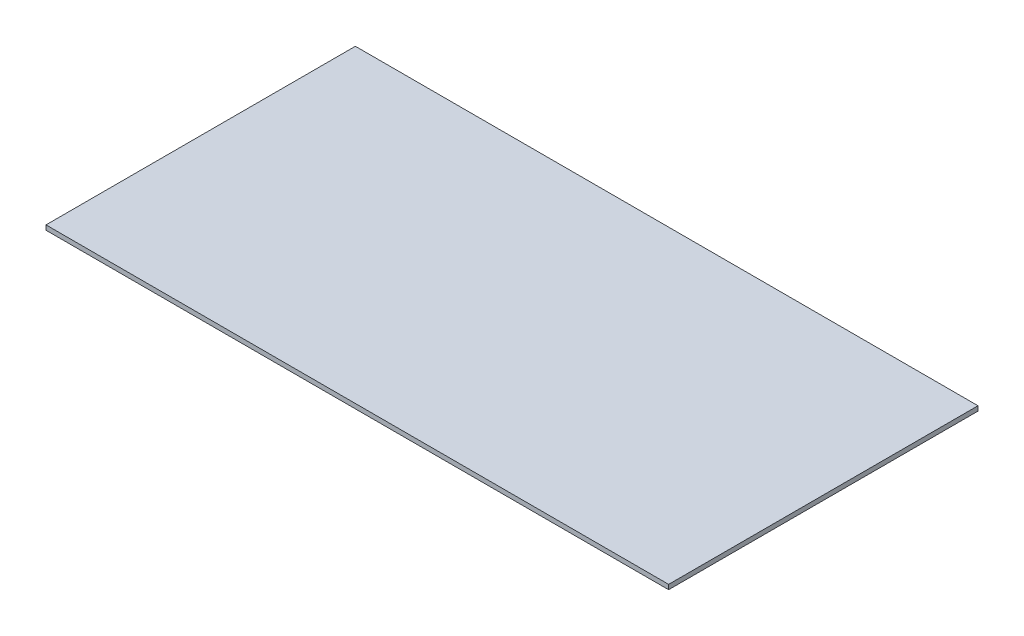
ISO-10303-21;
HEADER;
FILE_DESCRIPTION(('STEP AP214'),'2;1');
FILE_NAME('part.step','',(''),(''),'','','');
FILE_SCHEMA(('AUTOMOTIVE_DESIGN { 1 0 10303 214 1 1 1 1 }'));
ENDSEC;
DATA;
#1=APPLICATION_CONTEXT('core data for automotive mechanical design processes');
#2=APPLICATION_PROTOCOL_DEFINITION('international standard','automotive_design',2000,#1);
#3=PRODUCT_CONTEXT('',#1,'mechanical');
#4=PRODUCT('Part','Part','',(#3));
#5=PRODUCT_RELATED_PRODUCT_CATEGORY('part','',(#4));
#6=PRODUCT_DEFINITION_FORMATION('','',#4);
#7=PRODUCT_DEFINITION_CONTEXT('part definition',#1,'design');
#8=PRODUCT_DEFINITION('design','',#6,#7);
#9=PRODUCT_DEFINITION_SHAPE('','',#8);
#10=(LENGTH_UNIT() NAMED_UNIT(*) SI_UNIT(.MILLI.,.METRE.));
#11=(NAMED_UNIT(*) PLANE_ANGLE_UNIT() SI_UNIT($,.RADIAN.));
#12=(NAMED_UNIT(*) SI_UNIT($,.STERADIAN.) SOLID_ANGLE_UNIT());
#13=UNCERTAINTY_MEASURE_WITH_UNIT(LENGTH_MEASURE(1.E-05),#10,'distance_accuracy_value','');
#14=(GEOMETRIC_REPRESENTATION_CONTEXT(3) GLOBAL_UNCERTAINTY_ASSIGNED_CONTEXT((#13)) GLOBAL_UNIT_ASSIGNED_CONTEXT((#10,
#11,#12)) REPRESENTATION_CONTEXT('',''));
#15=CARTESIAN_POINT('',(0.,0.,0.));
#16=DIRECTION('',(0.,0.,1.));
#17=DIRECTION('',(1.,0.,0.));
#18=AXIS2_PLACEMENT_3D('',#15,#16,#17);
#19=CARTESIAN_POINT('',(-802.046035805626,12.,-363.286445012788));
#20=DIRECTION('',(1.,0.,0.));
#21=DIRECTION('',(0.,0.,-1.));
#22=AXIS2_PLACEMENT_3D('',#19,#20,#21);
#23=PLANE('',#22);
#24=DIRECTION('',(0.,0.,1.));
#25=VECTOR('',#24,1.);
#26=CARTESIAN_POINT('',(-802.046035805626,0.,-363.286445012788));
#27=LINE('',#26,#25);
#28=CARTESIAN_POINT('',(-802.046035805626,0.,-363.286445012788));
#29=VERTEX_POINT('',#28);
#30=CARTESIAN_POINT('',(-802.046035805626,0.,431.713554987212));
#31=VERTEX_POINT('',#30);
#32=EDGE_CURVE('E96',#29,#31,#27,.T.);
#33=ORIENTED_EDGE('',*,*,#32,.T.);
#34=DIRECTION('',(0.,-1.,0.));
#35=VECTOR('',#34,1.);
#36=CARTESIAN_POINT('',(-802.046035805626,12.,431.713554987212));
#37=LINE('',#36,#35);
#38=CARTESIAN_POINT('',(-802.046035805626,12.,431.713554987212));
#39=VERTEX_POINT('',#38);
#40=EDGE_CURVE('E11',#39,#31,#37,.T.);
#41=ORIENTED_EDGE('',*,*,#40,.F.);
#42=DIRECTION('',(0.,0.,1.));
#43=VECTOR('',#42,1.);
#44=CARTESIAN_POINT('',(-802.046035805626,12.,-363.286445012788));
#45=LINE('',#44,#43);
#46=CARTESIAN_POINT('',(-802.046035805626,12.,-363.286445012788));
#47=VERTEX_POINT('',#46);
#48=EDGE_CURVE('E84',#47,#39,#45,.T.);
#49=ORIENTED_EDGE('',*,*,#48,.F.);
#50=DIRECTION('',(0.,-1.,0.));
#51=VECTOR('',#50,1.);
#52=CARTESIAN_POINT('',(-802.046035805626,12.,-363.286445012788));
#53=LINE('',#52,#51);
#54=EDGE_CURVE('E92',#47,#29,#53,.T.);
#55=ORIENTED_EDGE('',*,*,#54,.T.);
#56=EDGE_LOOP('',(#33,#41,#49,#55));
#57=FACE_BOUND('',#56,.T.);
#58=ADVANCED_FACE('F33',(#57),#23,.F.);
#59=CARTESIAN_POINT('',(-802.046035805626,12.,431.713554987212));
#60=DIRECTION('',(0.,0.,-1.));
#61=DIRECTION('',(-1.,0.,0.));
#62=AXIS2_PLACEMENT_3D('',#59,#60,#61);
#63=PLANE('',#62);
#64=DIRECTION('',(1.,0.,0.));
#65=VECTOR('',#64,1.);
#66=CARTESIAN_POINT('',(-802.046035805626,0.,431.713554987212));
#67=LINE('',#66,#65);
#68=CARTESIAN_POINT('',(797.953964194374,0.,431.713554987212));
#69=VERTEX_POINT('',#68);
#70=EDGE_CURVE('E88',#31,#69,#67,.T.);
#71=ORIENTED_EDGE('',*,*,#70,.T.);
#72=DIRECTION('',(0.,-1.,0.));
#73=VECTOR('',#72,1.);
#74=CARTESIAN_POINT('',(797.953964194374,12.,431.713554987212));
#75=LINE('',#74,#73);
#76=CARTESIAN_POINT('',(797.953964194374,12.,431.713554987212));
#77=VERTEX_POINT('',#76);
#78=EDGE_CURVE('E41',#77,#69,#75,.T.);
#79=ORIENTED_EDGE('',*,*,#78,.F.);
#80=DIRECTION('',(1.,0.,0.));
#81=VECTOR('',#80,1.);
#82=CARTESIAN_POINT('',(-802.046035805626,12.,431.713554987212));
#83=LINE('',#82,#81);
#84=EDGE_CURVE('E79',#39,#77,#83,.T.);
#85=ORIENTED_EDGE('',*,*,#84,.F.);
#86=ORIENTED_EDGE('',*,*,#40,.T.);
#87=EDGE_LOOP('',(#71,#79,#85,#86));
#88=FACE_BOUND('',#87,.T.);
#89=ADVANCED_FACE('F87',(#88),#63,.F.);
#90=CARTESIAN_POINT('',(797.953964194374,12.,-363.286445012788));
#91=DIRECTION('',(-1.,0.,0.));
#92=DIRECTION('',(0.,0.,1.));
#93=AXIS2_PLACEMENT_3D('',#90,#91,#92);
#94=PLANE('',#93);
#95=DIRECTION('',(0.,0.,-1.));
#96=VECTOR('',#95,1.);
#97=CARTESIAN_POINT('',(797.953964194374,0.,-363.286445012788));
#98=LINE('',#97,#96);
#99=CARTESIAN_POINT('',(797.953964194374,0.,-363.286445012788));
#100=VERTEX_POINT('',#99);
#101=EDGE_CURVE('E66',#69,#100,#98,.T.);
#102=ORIENTED_EDGE('',*,*,#101,.T.);
#103=DIRECTION('',(0.,-1.,0.));
#104=VECTOR('',#103,1.);
#105=CARTESIAN_POINT('',(797.953964194374,12.,-363.286445012788));
#106=LINE('',#105,#104);
#107=CARTESIAN_POINT('',(797.953964194374,12.,-363.286445012788));
#108=VERTEX_POINT('',#107);
#109=EDGE_CURVE('E89',#108,#100,#106,.T.);
#110=ORIENTED_EDGE('',*,*,#109,.F.);
#111=DIRECTION('',(0.,0.,-1.));
#112=VECTOR('',#111,1.);
#113=CARTESIAN_POINT('',(797.953964194374,12.,-363.286445012788));
#114=LINE('',#113,#112);
#115=EDGE_CURVE('E82',#77,#108,#114,.T.);
#116=ORIENTED_EDGE('',*,*,#115,.F.);
#117=ORIENTED_EDGE('',*,*,#78,.T.);
#118=EDGE_LOOP('',(#102,#110,#116,#117));
#119=FACE_BOUND('',#118,.T.);
#120=ADVANCED_FACE('F90',(#119),#94,.F.);
#121=CARTESIAN_POINT('',(-802.046035805626,12.,-363.286445012788));
#122=DIRECTION('',(0.,0.,1.));
#123=DIRECTION('',(1.,0.,0.));
#124=AXIS2_PLACEMENT_3D('',#121,#122,#123);
#125=PLANE('',#124);
#126=DIRECTION('',(-1.,0.,0.));
#127=VECTOR('',#126,1.);
#128=CARTESIAN_POINT('',(-802.046035805626,0.,-363.286445012788));
#129=LINE('',#128,#127);
#130=EDGE_CURVE('E72',#100,#29,#129,.T.);
#131=ORIENTED_EDGE('',*,*,#130,.T.);
#132=ORIENTED_EDGE('',*,*,#54,.F.);
#133=DIRECTION('',(-1.,0.,0.));
#134=VECTOR('',#133,1.);
#135=CARTESIAN_POINT('',(-802.046035805626,12.,-363.286445012788));
#136=LINE('',#135,#134);
#137=EDGE_CURVE('E49',#108,#47,#136,.T.);
#138=ORIENTED_EDGE('',*,*,#137,.F.);
#139=ORIENTED_EDGE('',*,*,#109,.T.);
#140=EDGE_LOOP('',(#131,#132,#138,#139));
#141=FACE_BOUND('',#140,.T.);
#142=ADVANCED_FACE('F103',(#141),#125,.F.);
#143=CARTESIAN_POINT('',(0.,12.,0.));
#144=DIRECTION('',(0.,1.,0.));
#145=DIRECTION('',(0.,0.,1.));
#146=AXIS2_PLACEMENT_3D('',#143,#144,#145);
#147=PLANE('',#146);
#148=ORIENTED_EDGE('',*,*,#48,.T.);
#149=ORIENTED_EDGE('',*,*,#84,.T.);
#150=ORIENTED_EDGE('',*,*,#115,.T.);
#151=ORIENTED_EDGE('',*,*,#137,.T.);
#152=EDGE_LOOP('',(#148,#149,#150,#151));
#153=FACE_BOUND('',#152,.T.);
#154=ADVANCED_FACE('F80',(#153),#147,.T.);
#155=CARTESIAN_POINT('',(0.,0.,0.));
#156=DIRECTION('',(0.,1.,0.));
#157=DIRECTION('',(0.,0.,1.));
#158=AXIS2_PLACEMENT_3D('',#155,#156,#157);
#159=PLANE('',#158);
#160=ORIENTED_EDGE('',*,*,#32,.F.);
#161=ORIENTED_EDGE('',*,*,#130,.F.);
#162=ORIENTED_EDGE('',*,*,#101,.F.);
#163=ORIENTED_EDGE('',*,*,#70,.F.);
#164=EDGE_LOOP('',(#160,#161,#162,#163));
#165=FACE_BOUND('',#164,.T.);
#166=ADVANCED_FACE('F106',(#165),#159,.F.);
#167=CLOSED_SHELL('',(#58,#89,#120,#142,#154,#166));
#168=MANIFOLD_SOLID_BREP('B2',#167);
#169=ADVANCED_BREP_SHAPE_REPRESENTATION('',(#18,#168),#14);
#170=SHAPE_DEFINITION_REPRESENTATION(#9,#169);
ENDSEC;
END-ISO-10303-21;
